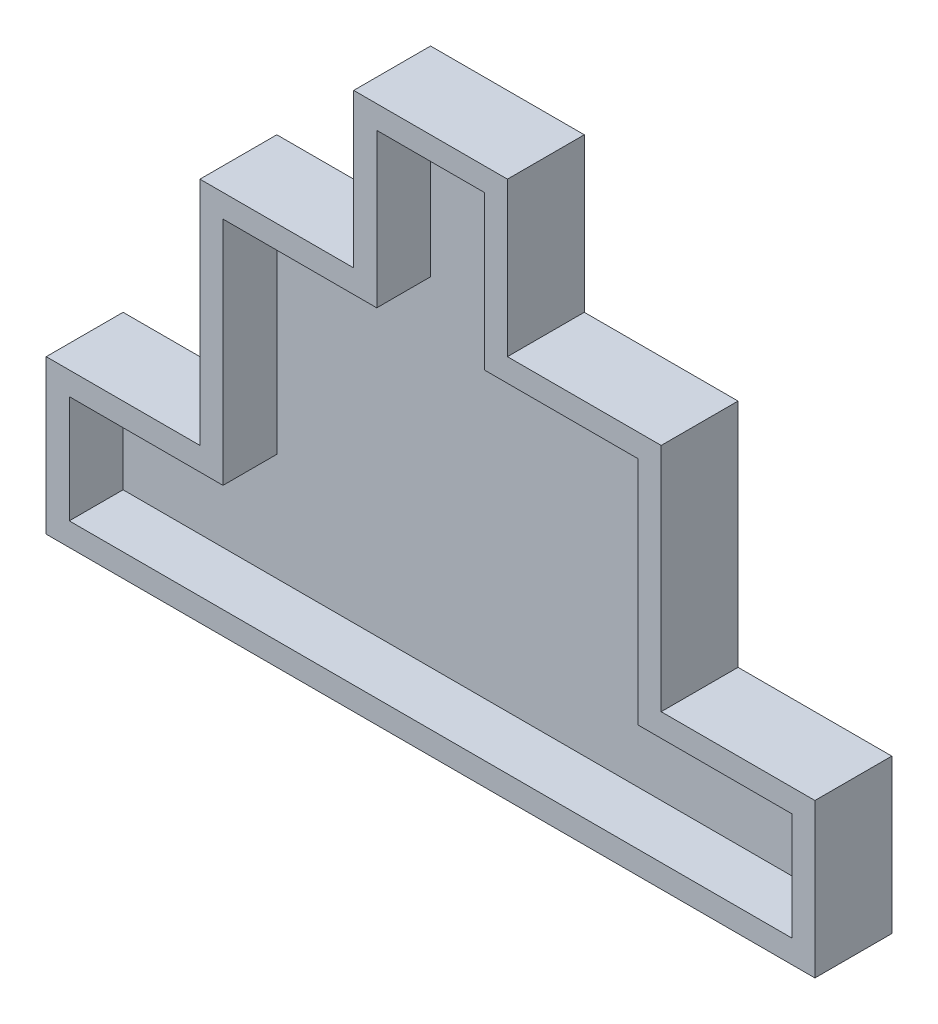
ISO-10303-21;
HEADER;
FILE_DESCRIPTION(('STEP AP214'),'2;1');
FILE_NAME('part.step','',(''),(''),'','','');
FILE_SCHEMA(('AUTOMOTIVE_DESIGN { 1 0 10303 214 1 1 1 1 }'));
ENDSEC;
DATA;
#1=APPLICATION_CONTEXT('core data for automotive mechanical design processes');
#2=APPLICATION_PROTOCOL_DEFINITION('international standard','automotive_design',2000,#1);
#3=PRODUCT_CONTEXT('',#1,'mechanical');
#4=PRODUCT('Part','Part','',(#3));
#5=PRODUCT_RELATED_PRODUCT_CATEGORY('part','',(#4));
#6=PRODUCT_DEFINITION_FORMATION('','',#4);
#7=PRODUCT_DEFINITION_CONTEXT('part definition',#1,'design');
#8=PRODUCT_DEFINITION('design','',#6,#7);
#9=PRODUCT_DEFINITION_SHAPE('','',#8);
#10=(LENGTH_UNIT() NAMED_UNIT(*) SI_UNIT(.MILLI.,.METRE.));
#11=(NAMED_UNIT(*) PLANE_ANGLE_UNIT() SI_UNIT($,.RADIAN.));
#12=(NAMED_UNIT(*) SI_UNIT($,.STERADIAN.) SOLID_ANGLE_UNIT());
#13=UNCERTAINTY_MEASURE_WITH_UNIT(LENGTH_MEASURE(1.E-05),#10,'distance_accuracy_value','');
#14=(GEOMETRIC_REPRESENTATION_CONTEXT(3) GLOBAL_UNCERTAINTY_ASSIGNED_CONTEXT((#13)) GLOBAL_UNIT_ASSIGNED_CONTEXT((#10,
#11,#12)) REPRESENTATION_CONTEXT('',''));
#15=CARTESIAN_POINT('',(0.,0.,0.));
#16=DIRECTION('',(0.,0.,1.));
#17=DIRECTION('',(1.,0.,0.));
#18=AXIS2_PLACEMENT_3D('',#15,#16,#17);
#19=CARTESIAN_POINT('',(-45.,-22.5,4.5));
#20=DIRECTION('',(-1.,0.,0.));
#21=DIRECTION('',(0.,0.,1.));
#22=AXIS2_PLACEMENT_3D('',#19,#20,#21);
#23=PLANE('',#22);
#24=DIRECTION('',(0.,1.,0.));
#25=VECTOR('',#24,1.);
#26=CARTESIAN_POINT('',(-45.,-22.5,0.));
#27=LINE('',#26,#25);
#28=CARTESIAN_POINT('',(-45.,-22.5,0.));
#29=VERTEX_POINT('',#28);
#30=CARTESIAN_POINT('',(-45.,22.5,0.));
#31=VERTEX_POINT('',#30);
#32=EDGE_CURVE('E209',#29,#31,#27,.T.);
#33=ORIENTED_EDGE('',*,*,#32,.F.);
#34=DIRECTION('',(0.,0.,-1.));
#35=VECTOR('',#34,1.);
#36=CARTESIAN_POINT('',(-45.,-22.5,4.5));
#37=LINE('',#36,#35);
#38=CARTESIAN_POINT('',(-45.,-22.5,15.));
#39=VERTEX_POINT('',#38);
#40=EDGE_CURVE('E11',#39,#29,#37,.T.);
#41=ORIENTED_EDGE('',*,*,#40,.F.);
#42=DIRECTION('',(0.,-1.,0.));
#43=VECTOR('',#42,1.);
#44=CARTESIAN_POINT('',(-45.,0.,15.));
#45=LINE('',#44,#43);
#46=CARTESIAN_POINT('',(-45.,22.5,15.));
#47=VERTEX_POINT('',#46);
#48=EDGE_CURVE('E257',#47,#39,#45,.T.);
#49=ORIENTED_EDGE('',*,*,#48,.F.);
#50=DIRECTION('',(0.,0.,-1.));
#51=VECTOR('',#50,1.);
#52=CARTESIAN_POINT('',(-45.,22.5,4.5));
#53=LINE('',#52,#51);
#54=EDGE_CURVE('E40',#47,#31,#53,.T.);
#55=ORIENTED_EDGE('',*,*,#54,.T.);
#56=EDGE_LOOP('',(#33,#41,#49,#55));
#57=FACE_BOUND('',#56,.T.);
#58=ADVANCED_FACE('F37',(#57),#23,.T.);
#59=CARTESIAN_POINT('',(-75.,-22.5,4.5));
#60=DIRECTION('',(0.,1.,0.));
#61=DIRECTION('',(0.,0.,1.));
#62=AXIS2_PLACEMENT_3D('',#59,#60,#61);
#63=PLANE('',#62);
#64=DIRECTION('',(1.,0.,0.));
#65=VECTOR('',#64,1.);
#66=CARTESIAN_POINT('',(-75.,-22.5,0.));
#67=LINE('',#66,#65);
#68=CARTESIAN_POINT('',(-75.,-22.5,0.));
#69=VERTEX_POINT('',#68);
#70=EDGE_CURVE('E368',#69,#29,#67,.T.);
#71=ORIENTED_EDGE('',*,*,#70,.F.);
#72=DIRECTION('',(0.,0.,-1.));
#73=VECTOR('',#72,1.);
#74=CARTESIAN_POINT('',(-75.,-22.5,4.5));
#75=LINE('',#74,#73);
#76=CARTESIAN_POINT('',(-75.,-22.5,15.));
#77=VERTEX_POINT('',#76);
#78=EDGE_CURVE('E45',#77,#69,#75,.T.);
#79=ORIENTED_EDGE('',*,*,#78,.F.);
#80=DIRECTION('',(-1.,0.,0.));
#81=VECTOR('',#80,1.);
#82=CARTESIAN_POINT('',(0.,-22.5,15.));
#83=LINE('',#82,#81);
#84=EDGE_CURVE('E260',#39,#77,#83,.T.);
#85=ORIENTED_EDGE('',*,*,#84,.F.);
#86=ORIENTED_EDGE('',*,*,#40,.T.);
#87=EDGE_LOOP('',(#71,#79,#85,#86));
#88=FACE_BOUND('',#87,.T.);
#89=ADVANCED_FACE('F404',(#88),#63,.T.);
#90=CARTESIAN_POINT('',(-75.,-52.5,4.5));
#91=DIRECTION('',(-1.,0.,0.));
#92=DIRECTION('',(0.,0.,1.));
#93=AXIS2_PLACEMENT_3D('',#90,#91,#92);
#94=PLANE('',#93);
#95=DIRECTION('',(0.,1.,0.));
#96=VECTOR('',#95,1.);
#97=CARTESIAN_POINT('',(-75.,-52.5,0.));
#98=LINE('',#97,#96);
#99=CARTESIAN_POINT('',(-75.,-52.5,0.));
#100=VERTEX_POINT('',#99);
#101=EDGE_CURVE('E365',#100,#69,#98,.T.);
#102=ORIENTED_EDGE('',*,*,#101,.F.);
#103=DIRECTION('',(0.,0.,-1.));
#104=VECTOR('',#103,1.);
#105=CARTESIAN_POINT('',(-75.,-52.5,4.5));
#106=LINE('',#105,#104);
#107=CARTESIAN_POINT('',(-75.,-52.5,15.));
#108=VERTEX_POINT('',#107);
#109=EDGE_CURVE('E372',#108,#100,#106,.T.);
#110=ORIENTED_EDGE('',*,*,#109,.F.);
#111=DIRECTION('',(0.,-1.,0.));
#112=VECTOR('',#111,1.);
#113=CARTESIAN_POINT('',(-75.,0.,15.));
#114=LINE('',#113,#112);
#115=EDGE_CURVE('E263',#77,#108,#114,.T.);
#116=ORIENTED_EDGE('',*,*,#115,.F.);
#117=ORIENTED_EDGE('',*,*,#78,.T.);
#118=EDGE_LOOP('',(#102,#110,#116,#117));
#119=FACE_BOUND('',#118,.T.);
#120=ADVANCED_FACE('F408',(#119),#94,.T.);
#121=CARTESIAN_POINT('',(-75.,-52.5,4.5));
#122=DIRECTION('',(0.,1.,0.));
#123=DIRECTION('',(0.,0.,1.));
#124=AXIS2_PLACEMENT_3D('',#121,#122,#123);
#125=PLANE('',#124);
#126=DIRECTION('',(1.,0.,0.));
#127=VECTOR('',#126,1.);
#128=CARTESIAN_POINT('',(-75.,-52.5,0.));
#129=LINE('',#128,#127);
#130=CARTESIAN_POINT('',(75.,-52.5,0.));
#131=VERTEX_POINT('',#130);
#132=EDGE_CURVE('E363',#100,#131,#129,.T.);
#133=ORIENTED_EDGE('',*,*,#132,.T.);
#134=DIRECTION('',(0.,0.,-1.));
#135=VECTOR('',#134,1.);
#136=CARTESIAN_POINT('',(75.,-52.5,4.5));
#137=LINE('',#136,#135);
#138=CARTESIAN_POINT('',(75.,-52.5,15.));
#139=VERTEX_POINT('',#138);
#140=EDGE_CURVE('E374',#139,#131,#137,.T.);
#141=ORIENTED_EDGE('',*,*,#140,.F.);
#142=DIRECTION('',(1.,0.,0.));
#143=VECTOR('',#142,1.);
#144=CARTESIAN_POINT('',(0.,-52.5,15.));
#145=LINE('',#144,#143);
#146=EDGE_CURVE('E266',#108,#139,#145,.T.);
#147=ORIENTED_EDGE('',*,*,#146,.F.);
#148=ORIENTED_EDGE('',*,*,#109,.T.);
#149=EDGE_LOOP('',(#133,#141,#147,#148));
#150=FACE_BOUND('',#149,.T.);
#151=ADVANCED_FACE('F410',(#150),#125,.F.);
#152=CARTESIAN_POINT('',(75.,-52.5,4.5));
#153=DIRECTION('',(-1.,0.,0.));
#154=DIRECTION('',(0.,0.,1.));
#155=AXIS2_PLACEMENT_3D('',#152,#153,#154);
#156=PLANE('',#155);
#157=DIRECTION('',(0.,1.,0.));
#158=VECTOR('',#157,1.);
#159=CARTESIAN_POINT('',(75.,-52.5,0.));
#160=LINE('',#159,#158);
#161=CARTESIAN_POINT('',(75.,-22.5,0.));
#162=VERTEX_POINT('',#161);
#163=EDGE_CURVE('E361',#131,#162,#160,.T.);
#164=ORIENTED_EDGE('',*,*,#163,.T.);
#165=DIRECTION('',(0.,0.,-1.));
#166=VECTOR('',#165,1.);
#167=CARTESIAN_POINT('',(75.,-22.5,4.5));
#168=LINE('',#167,#166);
#169=CARTESIAN_POINT('',(75.,-22.5,15.));
#170=VERTEX_POINT('',#169);
#171=EDGE_CURVE('E377',#170,#162,#168,.T.);
#172=ORIENTED_EDGE('',*,*,#171,.F.);
#173=DIRECTION('',(0.,1.,0.));
#174=VECTOR('',#173,1.);
#175=CARTESIAN_POINT('',(75.,0.,15.));
#176=LINE('',#175,#174);
#177=EDGE_CURVE('E269',#139,#170,#176,.T.);
#178=ORIENTED_EDGE('',*,*,#177,.F.);
#179=ORIENTED_EDGE('',*,*,#140,.T.);
#180=EDGE_LOOP('',(#164,#172,#178,#179));
#181=FACE_BOUND('',#180,.T.);
#182=ADVANCED_FACE('F415',(#181),#156,.F.);
#183=CARTESIAN_POINT('',(75.,-22.5,4.5));
#184=DIRECTION('',(0.,-1.,0.));
#185=DIRECTION('',(0.,0.,-1.));
#186=AXIS2_PLACEMENT_3D('',#183,#184,#185);
#187=PLANE('',#186);
#188=DIRECTION('',(-1.,0.,0.));
#189=VECTOR('',#188,1.);
#190=CARTESIAN_POINT('',(75.,-22.5,0.));
#191=LINE('',#190,#189);
#192=CARTESIAN_POINT('',(45.,-22.5,0.));
#193=VERTEX_POINT('',#192);
#194=EDGE_CURVE('E359',#162,#193,#191,.T.);
#195=ORIENTED_EDGE('',*,*,#194,.T.);
#196=DIRECTION('',(0.,0.,-1.));
#197=VECTOR('',#196,1.);
#198=CARTESIAN_POINT('',(45.,-22.5,4.5));
#199=LINE('',#198,#197);
#200=CARTESIAN_POINT('',(45.,-22.5,15.));
#201=VERTEX_POINT('',#200);
#202=EDGE_CURVE('E380',#201,#193,#199,.T.);
#203=ORIENTED_EDGE('',*,*,#202,.F.);
#204=DIRECTION('',(-1.,0.,0.));
#205=VECTOR('',#204,1.);
#206=CARTESIAN_POINT('',(0.,-22.5,15.));
#207=LINE('',#206,#205);
#208=EDGE_CURVE('E272',#170,#201,#207,.T.);
#209=ORIENTED_EDGE('',*,*,#208,.F.);
#210=ORIENTED_EDGE('',*,*,#171,.T.);
#211=EDGE_LOOP('',(#195,#203,#209,#210));
#212=FACE_BOUND('',#211,.T.);
#213=ADVANCED_FACE('F419',(#212),#187,.F.);
#214=CARTESIAN_POINT('',(45.,-22.5,4.5));
#215=DIRECTION('',(-1.,0.,0.));
#216=DIRECTION('',(0.,0.,1.));
#217=AXIS2_PLACEMENT_3D('',#214,#215,#216);
#218=PLANE('',#217);
#219=DIRECTION('',(0.,1.,0.));
#220=VECTOR('',#219,1.);
#221=CARTESIAN_POINT('',(45.,-22.5,0.));
#222=LINE('',#221,#220);
#223=CARTESIAN_POINT('',(45.,22.5,0.));
#224=VERTEX_POINT('',#223);
#225=EDGE_CURVE('E357',#193,#224,#222,.T.);
#226=ORIENTED_EDGE('',*,*,#225,.T.);
#227=DIRECTION('',(0.,0.,-1.));
#228=VECTOR('',#227,1.);
#229=CARTESIAN_POINT('',(45.,22.5,4.5));
#230=LINE('',#229,#228);
#231=CARTESIAN_POINT('',(45.,22.5,15.));
#232=VERTEX_POINT('',#231);
#233=EDGE_CURVE('E383',#232,#224,#230,.T.);
#234=ORIENTED_EDGE('',*,*,#233,.F.);
#235=DIRECTION('',(0.,1.,0.));
#236=VECTOR('',#235,1.);
#237=CARTESIAN_POINT('',(45.,0.,15.));
#238=LINE('',#237,#236);
#239=EDGE_CURVE('E275',#201,#232,#238,.T.);
#240=ORIENTED_EDGE('',*,*,#239,.F.);
#241=ORIENTED_EDGE('',*,*,#202,.T.);
#242=EDGE_LOOP('',(#226,#234,#240,#241));
#243=FACE_BOUND('',#242,.T.);
#244=ADVANCED_FACE('F423',(#243),#218,.F.);
#245=CARTESIAN_POINT('',(45.,22.5,4.5));
#246=DIRECTION('',(0.,-1.,0.));
#247=DIRECTION('',(1.,0.,0.));
#248=AXIS2_PLACEMENT_3D('',#245,#246,#247);
#249=PLANE('',#248);
#250=DIRECTION('',(-1.,0.,0.));
#251=VECTOR('',#250,1.);
#252=CARTESIAN_POINT('',(45.,22.5,0.));
#253=LINE('',#252,#251);
#254=CARTESIAN_POINT('',(15.,22.5,0.));
#255=VERTEX_POINT('',#254);
#256=EDGE_CURVE('E355',#224,#255,#253,.T.);
#257=ORIENTED_EDGE('',*,*,#256,.T.);
#258=DIRECTION('',(0.,0.,-1.));
#259=VECTOR('',#258,1.);
#260=CARTESIAN_POINT('',(15.,22.5,4.5));
#261=LINE('',#260,#259);
#262=CARTESIAN_POINT('',(15.,22.5,15.));
#263=VERTEX_POINT('',#262);
#264=EDGE_CURVE('E386',#263,#255,#261,.T.);
#265=ORIENTED_EDGE('',*,*,#264,.F.);
#266=DIRECTION('',(-1.,0.,0.));
#267=VECTOR('',#266,1.);
#268=CARTESIAN_POINT('',(0.,22.5,15.));
#269=LINE('',#268,#267);
#270=EDGE_CURVE('E278',#232,#263,#269,.T.);
#271=ORIENTED_EDGE('',*,*,#270,.F.);
#272=ORIENTED_EDGE('',*,*,#233,.T.);
#273=EDGE_LOOP('',(#257,#265,#271,#272));
#274=FACE_BOUND('',#273,.T.);
#275=ADVANCED_FACE('F426',(#274),#249,.F.);
#276=CARTESIAN_POINT('',(15.,22.5,4.5));
#277=DIRECTION('',(-1.,0.,0.));
#278=DIRECTION('',(0.,-1.,0.));
#279=AXIS2_PLACEMENT_3D('',#276,#277,#278);
#280=PLANE('',#279);
#281=DIRECTION('',(0.,1.,0.));
#282=VECTOR('',#281,1.);
#283=CARTESIAN_POINT('',(15.,22.5,0.));
#284=LINE('',#283,#282);
#285=CARTESIAN_POINT('',(15.,52.5,0.));
#286=VERTEX_POINT('',#285);
#287=EDGE_CURVE('E352',#255,#286,#284,.T.);
#288=ORIENTED_EDGE('',*,*,#287,.T.);
#289=DIRECTION('',(0.,0.,-1.));
#290=VECTOR('',#289,1.);
#291=CARTESIAN_POINT('',(15.,52.5,4.5));
#292=LINE('',#291,#290);
#293=CARTESIAN_POINT('',(15.,52.5,15.));
#294=VERTEX_POINT('',#293);
#295=EDGE_CURVE('E389',#294,#286,#292,.T.);
#296=ORIENTED_EDGE('',*,*,#295,.F.);
#297=DIRECTION('',(0.,1.,0.));
#298=VECTOR('',#297,1.);
#299=CARTESIAN_POINT('',(15.0000000000001,0.,15.));
#300=LINE('',#299,#298);
#301=EDGE_CURVE('E281',#263,#294,#300,.T.);
#302=ORIENTED_EDGE('',*,*,#301,.F.);
#303=ORIENTED_EDGE('',*,*,#264,.T.);
#304=EDGE_LOOP('',(#288,#296,#302,#303));
#305=FACE_BOUND('',#304,.T.);
#306=ADVANCED_FACE('F430',(#305),#280,.F.);
#307=CARTESIAN_POINT('',(-15.,52.5,4.5));
#308=DIRECTION('',(0.,1.,0.));
#309=DIRECTION('',(0.,0.,1.));
#310=AXIS2_PLACEMENT_3D('',#307,#308,#309);
#311=PLANE('',#310);
#312=DIRECTION('',(1.,0.,0.));
#313=VECTOR('',#312,1.);
#314=CARTESIAN_POINT('',(-15.,52.5,0.));
#315=LINE('',#314,#313);
#316=CARTESIAN_POINT('',(-15.,52.5,0.));
#317=VERTEX_POINT('',#316);
#318=EDGE_CURVE('E349',#317,#286,#315,.T.);
#319=ORIENTED_EDGE('',*,*,#318,.F.);
#320=DIRECTION('',(0.,0.,-1.));
#321=VECTOR('',#320,1.);
#322=CARTESIAN_POINT('',(-15.,52.5,4.5));
#323=LINE('',#322,#321);
#324=CARTESIAN_POINT('',(-15.,52.5,15.));
#325=VERTEX_POINT('',#324);
#326=EDGE_CURVE('E391',#325,#317,#323,.T.);
#327=ORIENTED_EDGE('',*,*,#326,.F.);
#328=DIRECTION('',(-1.,0.,0.));
#329=VECTOR('',#328,1.);
#330=CARTESIAN_POINT('',(0.,52.5,15.));
#331=LINE('',#330,#329);
#332=EDGE_CURVE('E284',#294,#325,#331,.T.);
#333=ORIENTED_EDGE('',*,*,#332,.F.);
#334=ORIENTED_EDGE('',*,*,#295,.T.);
#335=EDGE_LOOP('',(#319,#327,#333,#334));
#336=FACE_BOUND('',#335,.T.);
#337=ADVANCED_FACE('F435',(#336),#311,.T.);
#338=CARTESIAN_POINT('',(-15.,22.5,4.5));
#339=DIRECTION('',(-1.,0.,0.));
#340=DIRECTION('',(0.,-1.,0.));
#341=AXIS2_PLACEMENT_3D('',#338,#339,#340);
#342=PLANE('',#341);
#343=DIRECTION('',(0.,1.,0.));
#344=VECTOR('',#343,1.);
#345=CARTESIAN_POINT('',(-15.,22.5,0.));
#346=LINE('',#345,#344);
#347=CARTESIAN_POINT('',(-15.,22.5,0.));
#348=VERTEX_POINT('',#347);
#349=EDGE_CURVE('E346',#348,#317,#346,.T.);
#350=ORIENTED_EDGE('',*,*,#349,.F.);
#351=DIRECTION('',(0.,0.,-1.));
#352=VECTOR('',#351,1.);
#353=CARTESIAN_POINT('',(-15.,22.5,4.5));
#354=LINE('',#353,#352);
#355=CARTESIAN_POINT('',(-15.,22.5,15.));
#356=VERTEX_POINT('',#355);
#357=EDGE_CURVE('E392',#356,#348,#354,.T.);
#358=ORIENTED_EDGE('',*,*,#357,.F.);
#359=DIRECTION('',(0.,-1.,0.));
#360=VECTOR('',#359,1.);
#361=CARTESIAN_POINT('',(-15.,0.,15.));
#362=LINE('',#361,#360);
#363=EDGE_CURVE('E287',#325,#356,#362,.T.);
#364=ORIENTED_EDGE('',*,*,#363,.F.);
#365=ORIENTED_EDGE('',*,*,#326,.T.);
#366=EDGE_LOOP('',(#350,#358,#364,#365));
#367=FACE_BOUND('',#366,.T.);
#368=ADVANCED_FACE('F437',(#367),#342,.T.);
#369=CARTESIAN_POINT('',(-45.,22.5,4.5));
#370=DIRECTION('',(0.,1.,0.));
#371=DIRECTION('',(0.,0.,1.));
#372=AXIS2_PLACEMENT_3D('',#369,#370,#371);
#373=PLANE('',#372);
#374=DIRECTION('',(1.,0.,0.));
#375=VECTOR('',#374,1.);
#376=CARTESIAN_POINT('',(-45.,22.5,0.));
#377=LINE('',#376,#375);
#378=EDGE_CURVE('E343',#31,#348,#377,.T.);
#379=ORIENTED_EDGE('',*,*,#378,.F.);
#380=ORIENTED_EDGE('',*,*,#54,.F.);
#381=DIRECTION('',(-1.,0.,0.));
#382=VECTOR('',#381,1.);
#383=CARTESIAN_POINT('',(0.,22.5,15.));
#384=LINE('',#383,#382);
#385=EDGE_CURVE('E254',#356,#47,#384,.T.);
#386=ORIENTED_EDGE('',*,*,#385,.F.);
#387=ORIENTED_EDGE('',*,*,#357,.T.);
#388=EDGE_LOOP('',(#379,#380,#386,#387));
#389=FACE_BOUND('',#388,.T.);
#390=ADVANCED_FACE('F399',(#389),#373,.T.);
#391=CARTESIAN_POINT('',(0.,0.,0.));
#392=DIRECTION('',(0.,0.,-1.));
#393=DIRECTION('',(-1.,0.,0.));
#394=AXIS2_PLACEMENT_3D('',#391,#392,#393);
#395=PLANE('',#394);
#396=ORIENTED_EDGE('',*,*,#32,.T.);
#397=ORIENTED_EDGE('',*,*,#378,.T.);
#398=ORIENTED_EDGE('',*,*,#349,.T.);
#399=ORIENTED_EDGE('',*,*,#318,.T.);
#400=ORIENTED_EDGE('',*,*,#287,.F.);
#401=ORIENTED_EDGE('',*,*,#256,.F.);
#402=ORIENTED_EDGE('',*,*,#225,.F.);
#403=ORIENTED_EDGE('',*,*,#194,.F.);
#404=ORIENTED_EDGE('',*,*,#163,.F.);
#405=ORIENTED_EDGE('',*,*,#132,.F.);
#406=ORIENTED_EDGE('',*,*,#101,.T.);
#407=ORIENTED_EDGE('',*,*,#70,.T.);
#408=EDGE_LOOP('',(#396,#397,#398,#399,#400,#401,#402,#403,#404,#405,#406,#407));
#409=FACE_BOUND('',#408,.T.);
#410=ADVANCED_FACE('F401',(#409),#395,.T.);
#411=CARTESIAN_POINT('',(0.,18.,15.));
#412=DIRECTION('',(0.,-1.,0.));
#413=DIRECTION('',(0.,0.,-1.));
#414=AXIS2_PLACEMENT_3D('',#411,#412,#413);
#415=PLANE('',#414);
#416=DIRECTION('',(-1.,0.,0.));
#417=VECTOR('',#416,1.);
#418=CARTESIAN_POINT('',(0.,18.,4.5));
#419=LINE('',#418,#417);
#420=CARTESIAN_POINT('',(-10.5,18.,4.5));
#421=VERTEX_POINT('',#420);
#422=CARTESIAN_POINT('',(-40.5,18.,4.5));
#423=VERTEX_POINT('',#422);
#424=EDGE_CURVE('E204',#421,#423,#419,.T.);
#425=ORIENTED_EDGE('',*,*,#424,.F.);
#426=DIRECTION('',(0.,0.,-1.));
#427=VECTOR('',#426,1.);
#428=CARTESIAN_POINT('',(-10.5,18.,15.));
#429=LINE('',#428,#427);
#430=CARTESIAN_POINT('',(-10.5,18.,15.));
#431=VERTEX_POINT('',#430);
#432=EDGE_CURVE('E198',#431,#421,#429,.T.);
#433=ORIENTED_EDGE('',*,*,#432,.F.);
#434=DIRECTION('',(-1.,0.,0.));
#435=VECTOR('',#434,1.);
#436=CARTESIAN_POINT('',(0.,18.,15.));
#437=LINE('',#436,#435);
#438=CARTESIAN_POINT('',(-40.5,18.,15.));
#439=VERTEX_POINT('',#438);
#440=EDGE_CURVE('E201',#431,#439,#437,.T.);
#441=ORIENTED_EDGE('',*,*,#440,.T.);
#442=DIRECTION('',(0.,0.,-1.));
#443=VECTOR('',#442,1.);
#444=CARTESIAN_POINT('',(-40.5,18.,15.));
#445=LINE('',#444,#443);
#446=EDGE_CURVE('E290',#439,#423,#445,.T.);
#447=ORIENTED_EDGE('',*,*,#446,.T.);
#448=EDGE_LOOP('',(#425,#433,#441,#447));
#449=FACE_BOUND('',#448,.T.);
#450=ADVANCED_FACE('F200',(#449),#415,.T.);
#451=CARTESIAN_POINT('',(-10.5,0.,15.));
#452=DIRECTION('',(1.,0.,0.));
#453=DIRECTION('',(0.,1.,0.));
#454=AXIS2_PLACEMENT_3D('',#451,#452,#453);
#455=PLANE('',#454);
#456=DIRECTION('',(0.,-1.,0.));
#457=VECTOR('',#456,1.);
#458=CARTESIAN_POINT('',(-10.5,0.,4.5));
#459=LINE('',#458,#457);
#460=CARTESIAN_POINT('',(-10.5,48.,4.5));
#461=VERTEX_POINT('',#460);
#462=EDGE_CURVE('E292',#461,#421,#459,.T.);
#463=ORIENTED_EDGE('',*,*,#462,.F.);
#464=DIRECTION('',(0.,0.,-1.));
#465=VECTOR('',#464,1.);
#466=CARTESIAN_POINT('',(-10.5,48.,15.));
#467=LINE('',#466,#465);
#468=CARTESIAN_POINT('',(-10.5,48.,15.));
#469=VERTEX_POINT('',#468);
#470=EDGE_CURVE('E210',#469,#461,#467,.T.);
#471=ORIENTED_EDGE('',*,*,#470,.F.);
#472=DIRECTION('',(0.,-1.,0.));
#473=VECTOR('',#472,1.);
#474=CARTESIAN_POINT('',(-10.5,0.,15.));
#475=LINE('',#474,#473);
#476=EDGE_CURVE('E217',#469,#431,#475,.T.);
#477=ORIENTED_EDGE('',*,*,#476,.T.);
#478=ORIENTED_EDGE('',*,*,#432,.T.);
#479=EDGE_LOOP('',(#463,#471,#477,#478));
#480=FACE_BOUND('',#479,.T.);
#481=ADVANCED_FACE('F224',(#480),#455,.T.);
#482=CARTESIAN_POINT('',(0.,48.,15.));
#483=DIRECTION('',(0.,-1.,0.));
#484=DIRECTION('',(0.,0.,-1.));
#485=AXIS2_PLACEMENT_3D('',#482,#483,#484);
#486=PLANE('',#485);
#487=DIRECTION('',(-1.,0.,0.));
#488=VECTOR('',#487,1.);
#489=CARTESIAN_POINT('',(0.,48.,4.5));
#490=LINE('',#489,#488);
#491=CARTESIAN_POINT('',(10.5,48.,4.5));
#492=VERTEX_POINT('',#491);
#493=EDGE_CURVE('E294',#492,#461,#490,.T.);
#494=ORIENTED_EDGE('',*,*,#493,.F.);
#495=DIRECTION('',(0.,0.,-1.));
#496=VECTOR('',#495,1.);
#497=CARTESIAN_POINT('',(10.5,48.,15.));
#498=LINE('',#497,#496);
#499=CARTESIAN_POINT('',(10.5,48.,15.));
#500=VERTEX_POINT('',#499);
#501=EDGE_CURVE('E338',#500,#492,#498,.T.);
#502=ORIENTED_EDGE('',*,*,#501,.F.);
#503=DIRECTION('',(-1.,0.,0.));
#504=VECTOR('',#503,1.);
#505=CARTESIAN_POINT('',(0.,48.,15.));
#506=LINE('',#505,#504);
#507=EDGE_CURVE('E225',#500,#469,#506,.T.);
#508=ORIENTED_EDGE('',*,*,#507,.T.);
#509=ORIENTED_EDGE('',*,*,#470,.T.);
#510=EDGE_LOOP('',(#494,#502,#508,#509));
#511=FACE_BOUND('',#510,.T.);
#512=ADVANCED_FACE('F507',(#511),#486,.T.);
#513=CARTESIAN_POINT('',(10.5000000000001,0.,15.));
#514=DIRECTION('',(-1.,0.,0.));
#515=DIRECTION('',(0.,-1.,0.));
#516=AXIS2_PLACEMENT_3D('',#513,#514,#515);
#517=PLANE('',#516);
#518=DIRECTION('',(0.,1.,0.));
#519=VECTOR('',#518,1.);
#520=CARTESIAN_POINT('',(10.5000000000001,0.,4.5));
#521=LINE('',#520,#519);
#522=CARTESIAN_POINT('',(10.5,18.,4.5));
#523=VERTEX_POINT('',#522);
#524=EDGE_CURVE('E297',#523,#492,#521,.T.);
#525=ORIENTED_EDGE('',*,*,#524,.F.);
#526=DIRECTION('',(0.,0.,-1.));
#527=VECTOR('',#526,1.);
#528=CARTESIAN_POINT('',(10.5,18.,15.));
#529=LINE('',#528,#527);
#530=CARTESIAN_POINT('',(10.5,18.,15.));
#531=VERTEX_POINT('',#530);
#532=EDGE_CURVE('E336',#531,#523,#529,.T.);
#533=ORIENTED_EDGE('',*,*,#532,.F.);
#534=DIRECTION('',(0.,1.,0.));
#535=VECTOR('',#534,1.);
#536=CARTESIAN_POINT('',(10.5000000000001,0.,15.));
#537=LINE('',#536,#535);
#538=EDGE_CURVE('E227',#531,#500,#537,.T.);
#539=ORIENTED_EDGE('',*,*,#538,.T.);
#540=ORIENTED_EDGE('',*,*,#501,.T.);
#541=EDGE_LOOP('',(#525,#533,#539,#540));
#542=FACE_BOUND('',#541,.T.);
#543=ADVANCED_FACE('F516',(#542),#517,.T.);
#544=CARTESIAN_POINT('',(0.,18.,15.));
#545=DIRECTION('',(0.,-1.,0.));
#546=DIRECTION('',(1.,0.,0.));
#547=AXIS2_PLACEMENT_3D('',#544,#545,#546);
#548=PLANE('',#547);
#549=DIRECTION('',(-1.,0.,0.));
#550=VECTOR('',#549,1.);
#551=CARTESIAN_POINT('',(0.,18.,4.5));
#552=LINE('',#551,#550);
#553=CARTESIAN_POINT('',(40.5,18.,4.5));
#554=VERTEX_POINT('',#553);
#555=EDGE_CURVE('E300',#554,#523,#552,.T.);
#556=ORIENTED_EDGE('',*,*,#555,.F.);
#557=DIRECTION('',(0.,0.,-1.));
#558=VECTOR('',#557,1.);
#559=CARTESIAN_POINT('',(40.5,18.,15.));
#560=LINE('',#559,#558);
#561=CARTESIAN_POINT('',(40.5,18.,15.));
#562=VERTEX_POINT('',#561);
#563=EDGE_CURVE('E334',#562,#554,#560,.T.);
#564=ORIENTED_EDGE('',*,*,#563,.F.);
#565=DIRECTION('',(-1.,0.,0.));
#566=VECTOR('',#565,1.);
#567=CARTESIAN_POINT('',(0.,18.,15.));
#568=LINE('',#567,#566);
#569=EDGE_CURVE('E232',#562,#531,#568,.T.);
#570=ORIENTED_EDGE('',*,*,#569,.T.);
#571=ORIENTED_EDGE('',*,*,#532,.T.);
#572=EDGE_LOOP('',(#556,#564,#570,#571));
#573=FACE_BOUND('',#572,.T.);
#574=ADVANCED_FACE('F526',(#573),#548,.T.);
#575=CARTESIAN_POINT('',(40.5,0.,15.));
#576=DIRECTION('',(-1.,0.,0.));
#577=DIRECTION('',(0.,0.,1.));
#578=AXIS2_PLACEMENT_3D('',#575,#576,#577);
#579=PLANE('',#578);
#580=DIRECTION('',(0.,1.,0.));
#581=VECTOR('',#580,1.);
#582=CARTESIAN_POINT('',(40.5,0.,4.5));
#583=LINE('',#582,#581);
#584=CARTESIAN_POINT('',(40.5,-27.,4.5));
#585=VERTEX_POINT('',#584);
#586=EDGE_CURVE('E303',#585,#554,#583,.T.);
#587=ORIENTED_EDGE('',*,*,#586,.F.);
#588=DIRECTION('',(0.,0.,-1.));
#589=VECTOR('',#588,1.);
#590=CARTESIAN_POINT('',(40.5,-27.,15.));
#591=LINE('',#590,#589);
#592=CARTESIAN_POINT('',(40.5,-27.,15.));
#593=VERTEX_POINT('',#592);
#594=EDGE_CURVE('E332',#593,#585,#591,.T.);
#595=ORIENTED_EDGE('',*,*,#594,.F.);
#596=DIRECTION('',(0.,1.,0.));
#597=VECTOR('',#596,1.);
#598=CARTESIAN_POINT('',(40.5,0.,15.));
#599=LINE('',#598,#597);
#600=EDGE_CURVE('E235',#593,#562,#599,.T.);
#601=ORIENTED_EDGE('',*,*,#600,.T.);
#602=ORIENTED_EDGE('',*,*,#563,.T.);
#603=EDGE_LOOP('',(#587,#595,#601,#602));
#604=FACE_BOUND('',#603,.T.);
#605=ADVANCED_FACE('F536',(#604),#579,.T.);
#606=CARTESIAN_POINT('',(0.,-27.,15.));
#607=DIRECTION('',(0.,-1.,0.));
#608=DIRECTION('',(0.,0.,-1.));
#609=AXIS2_PLACEMENT_3D('',#606,#607,#608);
#610=PLANE('',#609);
#611=DIRECTION('',(-1.,0.,0.));
#612=VECTOR('',#611,1.);
#613=CARTESIAN_POINT('',(0.,-27.,4.5));
#614=LINE('',#613,#612);
#615=CARTESIAN_POINT('',(70.5,-27.,4.5));
#616=VERTEX_POINT('',#615);
#617=EDGE_CURVE('E306',#616,#585,#614,.T.);
#618=ORIENTED_EDGE('',*,*,#617,.F.);
#619=DIRECTION('',(0.,0.,-1.));
#620=VECTOR('',#619,1.);
#621=CARTESIAN_POINT('',(70.5,-27.,15.));
#622=LINE('',#621,#620);
#623=CARTESIAN_POINT('',(70.5,-27.,15.));
#624=VERTEX_POINT('',#623);
#625=EDGE_CURVE('E330',#624,#616,#622,.T.);
#626=ORIENTED_EDGE('',*,*,#625,.F.);
#627=DIRECTION('',(-1.,0.,0.));
#628=VECTOR('',#627,1.);
#629=CARTESIAN_POINT('',(0.,-27.,15.));
#630=LINE('',#629,#628);
#631=EDGE_CURVE('E238',#624,#593,#630,.T.);
#632=ORIENTED_EDGE('',*,*,#631,.T.);
#633=ORIENTED_EDGE('',*,*,#594,.T.);
#634=EDGE_LOOP('',(#618,#626,#632,#633));
#635=FACE_BOUND('',#634,.T.);
#636=ADVANCED_FACE('F546',(#635),#610,.T.);
#637=CARTESIAN_POINT('',(70.5,0.,15.));
#638=DIRECTION('',(-1.,0.,0.));
#639=DIRECTION('',(0.,0.,1.));
#640=AXIS2_PLACEMENT_3D('',#637,#638,#639);
#641=PLANE('',#640);
#642=DIRECTION('',(0.,1.,0.));
#643=VECTOR('',#642,1.);
#644=CARTESIAN_POINT('',(70.5,0.,4.5));
#645=LINE('',#644,#643);
#646=CARTESIAN_POINT('',(70.5,-48.,4.5));
#647=VERTEX_POINT('',#646);
#648=EDGE_CURVE('E309',#647,#616,#645,.T.);
#649=ORIENTED_EDGE('',*,*,#648,.F.);
#650=DIRECTION('',(0.,0.,-1.));
#651=VECTOR('',#650,1.);
#652=CARTESIAN_POINT('',(70.5,-48.,15.));
#653=LINE('',#652,#651);
#654=CARTESIAN_POINT('',(70.5,-48.,15.));
#655=VERTEX_POINT('',#654);
#656=EDGE_CURVE('E328',#655,#647,#653,.T.);
#657=ORIENTED_EDGE('',*,*,#656,.F.);
#658=DIRECTION('',(0.,1.,0.));
#659=VECTOR('',#658,1.);
#660=CARTESIAN_POINT('',(70.5,0.,15.));
#661=LINE('',#660,#659);
#662=EDGE_CURVE('E241',#655,#624,#661,.T.);
#663=ORIENTED_EDGE('',*,*,#662,.T.);
#664=ORIENTED_EDGE('',*,*,#625,.T.);
#665=EDGE_LOOP('',(#649,#657,#663,#664));
#666=FACE_BOUND('',#665,.T.);
#667=ADVANCED_FACE('F556',(#666),#641,.T.);
#668=CARTESIAN_POINT('',(0.,-48.,15.));
#669=DIRECTION('',(0.,1.,0.));
#670=DIRECTION('',(0.,0.,1.));
#671=AXIS2_PLACEMENT_3D('',#668,#669,#670);
#672=PLANE('',#671);
#673=DIRECTION('',(1.,0.,0.));
#674=VECTOR('',#673,1.);
#675=CARTESIAN_POINT('',(0.,-48.,4.5));
#676=LINE('',#675,#674);
#677=CARTESIAN_POINT('',(-70.5,-48.,4.5));
#678=VERTEX_POINT('',#677);
#679=EDGE_CURVE('E312',#678,#647,#676,.T.);
#680=ORIENTED_EDGE('',*,*,#679,.F.);
#681=DIRECTION('',(0.,0.,-1.));
#682=VECTOR('',#681,1.);
#683=CARTESIAN_POINT('',(-70.5,-48.,15.));
#684=LINE('',#683,#682);
#685=CARTESIAN_POINT('',(-70.5,-48.,15.));
#686=VERTEX_POINT('',#685);
#687=EDGE_CURVE('E326',#686,#678,#684,.T.);
#688=ORIENTED_EDGE('',*,*,#687,.F.);
#689=DIRECTION('',(1.,0.,0.));
#690=VECTOR('',#689,1.);
#691=CARTESIAN_POINT('',(0.,-48.,15.));
#692=LINE('',#691,#690);
#693=EDGE_CURVE('E244',#686,#655,#692,.T.);
#694=ORIENTED_EDGE('',*,*,#693,.T.);
#695=ORIENTED_EDGE('',*,*,#656,.T.);
#696=EDGE_LOOP('',(#680,#688,#694,#695));
#697=FACE_BOUND('',#696,.T.);
#698=ADVANCED_FACE('F566',(#697),#672,.T.);
#699=CARTESIAN_POINT('',(-70.5,0.,15.));
#700=DIRECTION('',(1.,0.,0.));
#701=DIRECTION('',(0.,0.,-1.));
#702=AXIS2_PLACEMENT_3D('',#699,#700,#701);
#703=PLANE('',#702);
#704=DIRECTION('',(0.,-1.,0.));
#705=VECTOR('',#704,1.);
#706=CARTESIAN_POINT('',(-70.5,0.,4.5));
#707=LINE('',#706,#705);
#708=CARTESIAN_POINT('',(-70.5,-27.,4.5));
#709=VERTEX_POINT('',#708);
#710=EDGE_CURVE('E315',#709,#678,#707,.T.);
#711=ORIENTED_EDGE('',*,*,#710,.F.);
#712=DIRECTION('',(0.,0.,-1.));
#713=VECTOR('',#712,1.);
#714=CARTESIAN_POINT('',(-70.5,-27.,15.));
#715=LINE('',#714,#713);
#716=CARTESIAN_POINT('',(-70.5,-27.,15.));
#717=VERTEX_POINT('',#716);
#718=EDGE_CURVE('E324',#717,#709,#715,.T.);
#719=ORIENTED_EDGE('',*,*,#718,.F.);
#720=DIRECTION('',(0.,-1.,0.));
#721=VECTOR('',#720,1.);
#722=CARTESIAN_POINT('',(-70.5,0.,15.));
#723=LINE('',#722,#721);
#724=EDGE_CURVE('E247',#717,#686,#723,.T.);
#725=ORIENTED_EDGE('',*,*,#724,.T.);
#726=ORIENTED_EDGE('',*,*,#687,.T.);
#727=EDGE_LOOP('',(#711,#719,#725,#726));
#728=FACE_BOUND('',#727,.T.);
#729=ADVANCED_FACE('F576',(#728),#703,.T.);
#730=CARTESIAN_POINT('',(0.,-27.,15.));
#731=DIRECTION('',(0.,-1.,0.));
#732=DIRECTION('',(0.,0.,-1.));
#733=AXIS2_PLACEMENT_3D('',#730,#731,#732);
#734=PLANE('',#733);
#735=DIRECTION('',(-1.,0.,0.));
#736=VECTOR('',#735,1.);
#737=CARTESIAN_POINT('',(0.,-27.,4.5));
#738=LINE('',#737,#736);
#739=CARTESIAN_POINT('',(-40.5,-27.,4.5));
#740=VERTEX_POINT('',#739);
#741=EDGE_CURVE('E53',#740,#709,#738,.T.);
#742=ORIENTED_EDGE('',*,*,#741,.F.);
#743=DIRECTION('',(0.,0.,-1.));
#744=VECTOR('',#743,1.);
#745=CARTESIAN_POINT('',(-40.5,-27.,15.));
#746=LINE('',#745,#744);
#747=CARTESIAN_POINT('',(-40.5,-27.,15.));
#748=VERTEX_POINT('',#747);
#749=EDGE_CURVE('E322',#748,#740,#746,.T.);
#750=ORIENTED_EDGE('',*,*,#749,.F.);
#751=DIRECTION('',(-1.,0.,0.));
#752=VECTOR('',#751,1.);
#753=CARTESIAN_POINT('',(0.,-27.,15.));
#754=LINE('',#753,#752);
#755=EDGE_CURVE('E250',#748,#717,#754,.T.);
#756=ORIENTED_EDGE('',*,*,#755,.T.);
#757=ORIENTED_EDGE('',*,*,#718,.T.);
#758=EDGE_LOOP('',(#742,#750,#756,#757));
#759=FACE_BOUND('',#758,.T.);
#760=ADVANCED_FACE('F586',(#759),#734,.T.);
#761=CARTESIAN_POINT('',(-40.5,0.,15.));
#762=DIRECTION('',(1.,0.,0.));
#763=DIRECTION('',(0.,0.,-1.));
#764=AXIS2_PLACEMENT_3D('',#761,#762,#763);
#765=PLANE('',#764);
#766=DIRECTION('',(0.,-1.,0.));
#767=VECTOR('',#766,1.);
#768=CARTESIAN_POINT('',(-40.5,0.,4.5));
#769=LINE('',#768,#767);
#770=EDGE_CURVE('E222',#423,#740,#769,.T.);
#771=ORIENTED_EDGE('',*,*,#770,.F.);
#772=ORIENTED_EDGE('',*,*,#446,.F.);
#773=DIRECTION('',(0.,-1.,0.));
#774=VECTOR('',#773,1.);
#775=CARTESIAN_POINT('',(-40.5,0.,15.));
#776=LINE('',#775,#774);
#777=EDGE_CURVE('E221',#439,#748,#776,.T.);
#778=ORIENTED_EDGE('',*,*,#777,.T.);
#779=ORIENTED_EDGE('',*,*,#749,.T.);
#780=EDGE_LOOP('',(#771,#772,#778,#779));
#781=FACE_BOUND('',#780,.T.);
#782=ADVANCED_FACE('F596',(#781),#765,.T.);
#783=CARTESIAN_POINT('',(0.,0.,15.));
#784=DIRECTION('',(0.,0.,1.));
#785=DIRECTION('',(1.,0.,0.));
#786=AXIS2_PLACEMENT_3D('',#783,#784,#785);
#787=PLANE('',#786);
#788=ORIENTED_EDGE('',*,*,#440,.F.);
#789=ORIENTED_EDGE('',*,*,#476,.F.);
#790=ORIENTED_EDGE('',*,*,#507,.F.);
#791=ORIENTED_EDGE('',*,*,#538,.F.);
#792=ORIENTED_EDGE('',*,*,#569,.F.);
#793=ORIENTED_EDGE('',*,*,#600,.F.);
#794=ORIENTED_EDGE('',*,*,#631,.F.);
#795=ORIENTED_EDGE('',*,*,#662,.F.);
#796=ORIENTED_EDGE('',*,*,#693,.F.);
#797=ORIENTED_EDGE('',*,*,#724,.F.);
#798=ORIENTED_EDGE('',*,*,#755,.F.);
#799=ORIENTED_EDGE('',*,*,#777,.F.);
#800=EDGE_LOOP('',(#788,#789,#790,#791,#792,#793,#794,#795,#796,#797,#798,#799));
#801=FACE_BOUND('',#800,.T.);
#802=ORIENTED_EDGE('',*,*,#385,.T.);
#803=ORIENTED_EDGE('',*,*,#48,.T.);
#804=ORIENTED_EDGE('',*,*,#84,.T.);
#805=ORIENTED_EDGE('',*,*,#115,.T.);
#806=ORIENTED_EDGE('',*,*,#146,.T.);
#807=ORIENTED_EDGE('',*,*,#177,.T.);
#808=ORIENTED_EDGE('',*,*,#208,.T.);
#809=ORIENTED_EDGE('',*,*,#239,.T.);
#810=ORIENTED_EDGE('',*,*,#270,.T.);
#811=ORIENTED_EDGE('',*,*,#301,.T.);
#812=ORIENTED_EDGE('',*,*,#332,.T.);
#813=ORIENTED_EDGE('',*,*,#363,.T.);
#814=EDGE_LOOP('',(#802,#803,#804,#805,#806,#807,#808,#809,#810,#811,#812,#813));
#815=FACE_BOUND('',#814,.T.);
#816=ADVANCED_FACE('F214',(#801,#815),#787,.T.);
#817=CARTESIAN_POINT('',(0.,0.,4.5));
#818=DIRECTION('',(0.,0.,-1.));
#819=DIRECTION('',(-1.,0.,0.));
#820=AXIS2_PLACEMENT_3D('',#817,#818,#819);
#821=PLANE('',#820);
#822=ORIENTED_EDGE('',*,*,#462,.T.);
#823=ORIENTED_EDGE('',*,*,#424,.T.);
#824=ORIENTED_EDGE('',*,*,#770,.T.);
#825=ORIENTED_EDGE('',*,*,#741,.T.);
#826=ORIENTED_EDGE('',*,*,#710,.T.);
#827=ORIENTED_EDGE('',*,*,#679,.T.);
#828=ORIENTED_EDGE('',*,*,#648,.T.);
#829=ORIENTED_EDGE('',*,*,#617,.T.);
#830=ORIENTED_EDGE('',*,*,#586,.T.);
#831=ORIENTED_EDGE('',*,*,#555,.T.);
#832=ORIENTED_EDGE('',*,*,#524,.T.);
#833=ORIENTED_EDGE('',*,*,#493,.T.);
#834=EDGE_LOOP('',(#822,#823,#824,#825,#826,#827,#828,#829,#830,#831,#832,#833));
#835=FACE_BOUND('',#834,.T.);
#836=ADVANCED_FACE('F614',(#835),#821,.F.);
#837=CLOSED_SHELL('',(#58,#89,#120,#151,#182,#213,#244,#275,#306,#337,#368,#390,#410,#450,#481,
#512,#543,#574,#605,#636,#667,#698,#729,#760,#782,#816,#836));
#838=MANIFOLD_SOLID_BREP('B2',#837);
#839=ADVANCED_BREP_SHAPE_REPRESENTATION('',(#18,#838),#14);
#840=SHAPE_DEFINITION_REPRESENTATION(#9,#839);
ENDSEC;
END-ISO-10303-21;
